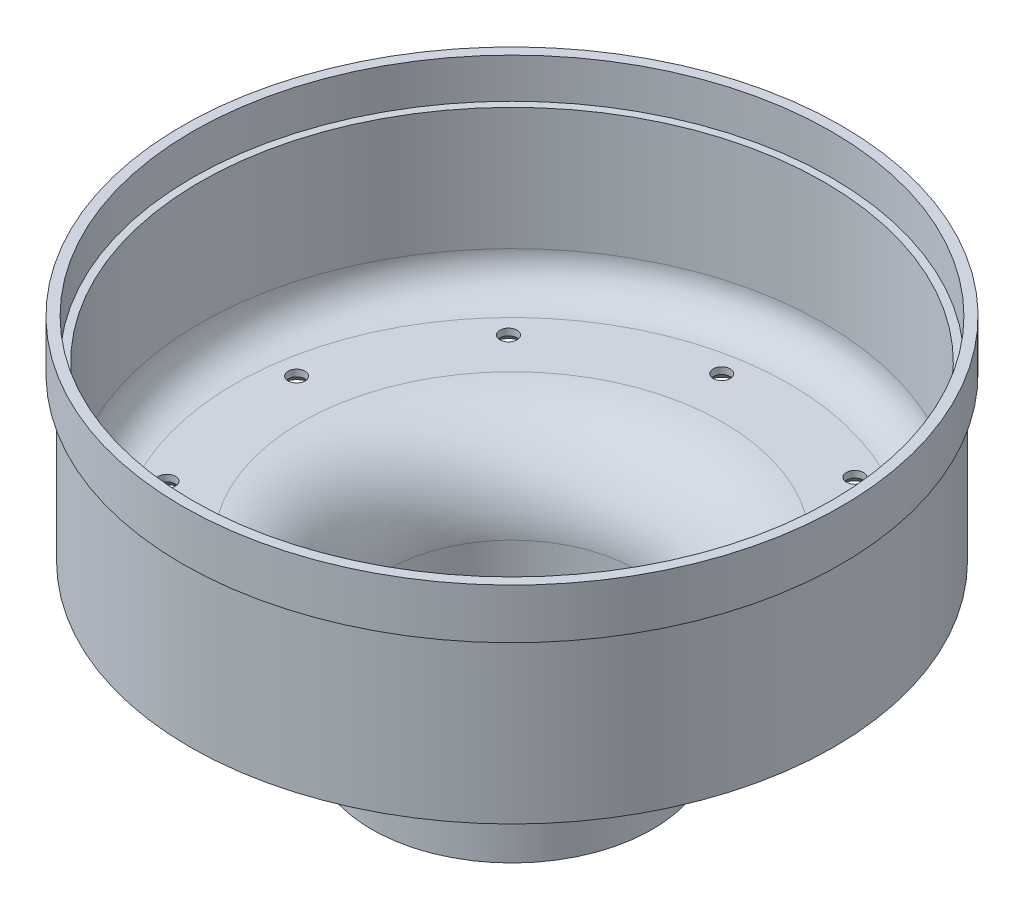
ISO-10303-21;
HEADER;
FILE_DESCRIPTION(('STEP AP214'),'2;1');
FILE_NAME('part.step','',(''),(''),'','','');
FILE_SCHEMA(('AUTOMOTIVE_DESIGN { 1 0 10303 214 1 1 1 1 }'));
ENDSEC;
DATA;
#1=APPLICATION_CONTEXT('core data for automotive mechanical design processes');
#2=APPLICATION_PROTOCOL_DEFINITION('international standard','automotive_design',2000,#1);
#3=PRODUCT_CONTEXT('',#1,'mechanical');
#4=PRODUCT('Part','Part','',(#3));
#5=PRODUCT_RELATED_PRODUCT_CATEGORY('part','',(#4));
#6=PRODUCT_DEFINITION_FORMATION('','',#4);
#7=PRODUCT_DEFINITION_CONTEXT('part definition',#1,'design');
#8=PRODUCT_DEFINITION('design','',#6,#7);
#9=PRODUCT_DEFINITION_SHAPE('','',#8);
#10=(LENGTH_UNIT() NAMED_UNIT(*) SI_UNIT(.MILLI.,.METRE.));
#11=(NAMED_UNIT(*) PLANE_ANGLE_UNIT() SI_UNIT($,.RADIAN.));
#12=(NAMED_UNIT(*) SI_UNIT($,.STERADIAN.) SOLID_ANGLE_UNIT());
#13=UNCERTAINTY_MEASURE_WITH_UNIT(LENGTH_MEASURE(1.E-05),#10,'distance_accuracy_value','');
#14=(GEOMETRIC_REPRESENTATION_CONTEXT(3) GLOBAL_UNCERTAINTY_ASSIGNED_CONTEXT((#13)) GLOBAL_UNIT_ASSIGNED_CONTEXT((#10,
#11,#12)) REPRESENTATION_CONTEXT('',''));
#15=CARTESIAN_POINT('',(0.,0.,0.));
#16=DIRECTION('',(0.,0.,1.));
#17=DIRECTION('',(1.,0.,0.));
#18=AXIS2_PLACEMENT_3D('',#15,#16,#17);
#19=CARTESIAN_POINT('',(26.6,-13.6483913577071,0.));
#20=DIRECTION('',(0.,-1.,0.));
#21=DIRECTION('',(0.,0.,-1.));
#22=AXIS2_PLACEMENT_3D('',#19,#20,#21);
#23=PLANE('',#22);
#24=CARTESIAN_POINT('',(0.,-13.6483913577071,0.));
#25=DIRECTION('',(0.,-1.,0.));
#26=DIRECTION('',(0.,0.,-1.));
#27=AXIS2_PLACEMENT_3D('',#24,#25,#26);
#28=CIRCLE('',#27,28.1);
#29=CARTESIAN_POINT('',(0.,-13.6483913577071,-28.1));
#30=VERTEX_POINT('',#29);
#31=EDGE_CURVE('E53',#30,#30,#28,.T.);
#32=ORIENTED_EDGE('',*,*,#31,.T.);
#33=EDGE_LOOP('',(#32));
#34=FACE_BOUND('',#33,.T.);
#35=CARTESIAN_POINT('',(0.,-13.6483913577071,0.));
#36=DIRECTION('',(0.,-1.,0.));
#37=DIRECTION('',(0.,0.,-1.));
#38=AXIS2_PLACEMENT_3D('',#35,#36,#37);
#39=CIRCLE('',#38,26.6);
#40=CARTESIAN_POINT('',(0.,-13.6483913577071,-26.6));
#41=VERTEX_POINT('',#40);
#42=EDGE_CURVE('E10',#41,#41,#39,.T.);
#43=ORIENTED_EDGE('',*,*,#42,.F.);
#44=EDGE_LOOP('',(#43));
#45=FACE_BOUND('',#44,.T.);
#46=ADVANCED_FACE('F34',(#34,#45),#23,.T.);
#47=CARTESIAN_POINT('',(0.,0.,0.));
#48=DIRECTION('',(0.,-1.,0.));
#49=DIRECTION('',(0.,0.,-1.));
#50=AXIS2_PLACEMENT_3D('',#47,#48,#49);
#51=CYLINDRICAL_SURFACE('',#50,26.6);
#52=ORIENTED_EDGE('',*,*,#42,.T.);
#53=EDGE_LOOP('',(#52));
#54=FACE_BOUND('',#53,.T.);
#55=CARTESIAN_POINT('',(0.,-3.64839135770706,0.));
#56=DIRECTION('',(0.,-1.,0.));
#57=DIRECTION('',(0.,0.,-1.));
#58=AXIS2_PLACEMENT_3D('',#55,#56,#57);
#59=CIRCLE('',#58,26.6);
#60=CARTESIAN_POINT('',(0.,-3.64839135770706,-26.6));
#61=VERTEX_POINT('',#60);
#62=EDGE_CURVE('E41',#61,#61,#59,.T.);
#63=ORIENTED_EDGE('',*,*,#62,.F.);
#64=EDGE_LOOP('',(#63));
#65=FACE_BOUND('',#64,.T.);
#66=ADVANCED_FACE('F184',(#54,#65),#51,.F.);
#67=CARTESIAN_POINT('',(26.6,-3.64839135770706,0.));
#68=DIRECTION('',(0.,-1.,0.));
#69=DIRECTION('',(0.,0.,-1.));
#70=AXIS2_PLACEMENT_3D('',#67,#68,#69);
#71=PLANE('',#70);
#72=ORIENTED_EDGE('',*,*,#62,.T.);
#73=EDGE_LOOP('',(#72));
#74=FACE_BOUND('',#73,.T.);
#75=CARTESIAN_POINT('',(0.,-3.64839135770706,0.));
#76=DIRECTION('',(0.,-1.,0.));
#77=DIRECTION('',(0.,0.,-1.));
#78=AXIS2_PLACEMENT_3D('',#75,#76,#77);
#79=CIRCLE('',#78,25.1);
#80=CARTESIAN_POINT('',(0.,-3.64839135770706,-25.1));
#81=VERTEX_POINT('',#80);
#82=EDGE_CURVE('E46',#81,#81,#79,.T.);
#83=ORIENTED_EDGE('',*,*,#82,.F.);
#84=EDGE_LOOP('',(#83));
#85=FACE_BOUND('',#84,.T.);
#86=ADVANCED_FACE('F182',(#74,#85),#71,.T.);
#87=CARTESIAN_POINT('',(0.,0.,0.));
#88=DIRECTION('',(0.,-1.,0.));
#89=DIRECTION('',(0.,0.,-1.));
#90=AXIS2_PLACEMENT_3D('',#87,#88,#89);
#91=CYLINDRICAL_SURFACE('',#90,25.1);
#92=ORIENTED_EDGE('',*,*,#82,.T.);
#93=EDGE_LOOP('',(#92));
#94=FACE_BOUND('',#93,.T.);
#95=CARTESIAN_POINT('',(0.,4.75160864229282,0.));
#96=DIRECTION('',(0.,-1.,0.));
#97=DIRECTION('',(0.,0.,-1.));
#98=AXIS2_PLACEMENT_3D('',#95,#96,#97);
#99=CIRCLE('',#98,25.1);
#100=CARTESIAN_POINT('',(0.,4.75160864229282,-25.1));
#101=VERTEX_POINT('',#100);
#102=EDGE_CURVE('E174',#101,#101,#99,.T.);
#103=ORIENTED_EDGE('',*,*,#102,.F.);
#104=EDGE_LOOP('',(#103));
#105=FACE_BOUND('',#104,.T.);
#106=ADVANCED_FACE('F179',(#94,#105),#91,.F.);
#107=CARTESIAN_POINT('',(0.,4.75160864229294,0.));
#108=DIRECTION('',(0.,-1.,0.));
#109=DIRECTION('',(0.,0.,-1.));
#110=AXIS2_PLACEMENT_3D('',#107,#108,#109);
#111=TOROIDAL_SURFACE('',#110,42.2,17.1);
#112=ORIENTED_EDGE('',*,*,#102,.T.);
#113=EDGE_LOOP('',(#112));
#114=FACE_BOUND('',#113,.T.);
#115=CARTESIAN_POINT('',(0.,21.8516086422929,0.));
#116=DIRECTION('',(0.,-1.,0.));
#117=DIRECTION('',(0.,0.,-1.));
#118=AXIS2_PLACEMENT_3D('',#115,#116,#117);
#119=CIRCLE('',#118,42.2000000000001);
#120=CARTESIAN_POINT('',(0.,21.8516086422929,-42.2000000000001));
#121=VERTEX_POINT('',#120);
#122=EDGE_CURVE('E171',#121,#121,#119,.T.);
#123=ORIENTED_EDGE('',*,*,#122,.F.);
#124=EDGE_LOOP('',(#123));
#125=FACE_BOUND('',#124,.T.);
#126=ADVANCED_FACE('F191',(#114,#125),#111,.T.);
#127=CARTESIAN_POINT('',(42.2000000000001,21.8516086422929,0.));
#128=DIRECTION('',(0.,1.,0.));
#129=DIRECTION('',(0.,0.,1.));
#130=AXIS2_PLACEMENT_3D('',#127,#128,#129);
#131=PLANE('',#130);
#132=CARTESIAN_POINT('',(-22.8065107885822,21.8516086422929,45.8515328604212));
#133=DIRECTION('',(0.,1.,0.));
#134=DIRECTION('',(0.,0.,1.));
#135=AXIS2_PLACEMENT_3D('',#132,#133,#134);
#136=CIRCLE('',#135,1.69999999999999);
#137=CARTESIAN_POINT('',(-22.8065107885822,21.8516086422929,47.5515328604212));
#138=VERTEX_POINT('',#137);
#139=EDGE_CURVE('E37',#138,#138,#136,.T.);
#140=ORIENTED_EDGE('',*,*,#139,.F.);
#141=EDGE_LOOP('',(#140));
#142=FACE_BOUND('',#141,.T.);
#143=CARTESIAN_POINT('',(-45.4017096207179,21.8516086422929,23.6893386044442));
#144=DIRECTION('',(0.,1.,0.));
#145=DIRECTION('',(0.,0.,1.));
#146=AXIS2_PLACEMENT_3D('',#143,#144,#145);
#147=CIRCLE('',#146,1.7);
#148=CARTESIAN_POINT('',(-45.4017096207179,21.8516086422929,25.3893386044442));
#149=VERTEX_POINT('',#148);
#150=EDGE_CURVE('E89',#149,#149,#147,.T.);
#151=ORIENTED_EDGE('',*,*,#150,.F.);
#152=EDGE_LOOP('',(#151));
#153=FACE_BOUND('',#152,.T.);
#154=CARTESIAN_POINT('',(-50.6549985250924,21.8516086422929,-7.52137782742555));
#155=DIRECTION('',(0.,1.,0.));
#156=DIRECTION('',(0.,0.,1.));
#157=AXIS2_PLACEMENT_3D('',#154,#155,#156);
#158=CIRCLE('',#157,1.7);
#159=CARTESIAN_POINT('',(-50.6549985250924,21.8516086422929,-5.82137782742556));
#160=VERTEX_POINT('',#159);
#161=EDGE_CURVE('E85',#160,#160,#158,.T.);
#162=ORIENTED_EDGE('',*,*,#161,.F.);
#163=EDGE_LOOP('',(#162));
#164=FACE_BOUND('',#163,.T.);
#165=CARTESIAN_POINT('',(-36.5597996929573,21.8516086422929,-35.8591835714485));
#166=DIRECTION('',(0.,1.,0.));
#167=DIRECTION('',(0.,0.,1.));
#168=AXIS2_PLACEMENT_3D('',#165,#166,#167);
#169=CIRCLE('',#168,1.7);
#170=CARTESIAN_POINT('',(-36.5597996929573,21.8516086422929,-34.1591835714485));
#171=VERTEX_POINT('',#170);
#172=EDGE_CURVE('E80',#171,#171,#169,.T.);
#173=ORIENTED_EDGE('',*,*,#172,.F.);
#174=EDGE_LOOP('',(#173));
#175=FACE_BOUND('',#174,.T.);
#176=CARTESIAN_POINT('',(-8.5,21.8516086422929,-50.5));
#177=DIRECTION('',(0.,1.,0.));
#178=DIRECTION('',(0.,0.,1.));
#179=AXIS2_PLACEMENT_3D('',#176,#177,#178);
#180=CIRCLE('',#179,1.69999999999999);
#181=CARTESIAN_POINT('',(-8.5,21.8516086422929,-48.8));
#182=VERTEX_POINT('',#181);
#183=EDGE_CURVE('E75',#182,#182,#180,.T.);
#184=ORIENTED_EDGE('',*,*,#183,.F.);
#185=EDGE_LOOP('',(#184));
#186=FACE_BOUND('',#185,.T.);
#187=CARTESIAN_POINT('',(22.8065107885826,21.8516086422929,-45.851532860421));
#188=DIRECTION('',(0.,1.,0.));
#189=DIRECTION('',(0.,0.,1.));
#190=AXIS2_PLACEMENT_3D('',#187,#188,#189);
#191=CIRCLE('',#190,1.69999999999999);
#192=CARTESIAN_POINT('',(22.8065107885826,21.8516086422929,-44.151532860421));
#193=VERTEX_POINT('',#192);
#194=EDGE_CURVE('E70',#193,#193,#191,.T.);
#195=ORIENTED_EDGE('',*,*,#194,.F.);
#196=EDGE_LOOP('',(#195));
#197=FACE_BOUND('',#196,.T.);
#198=CARTESIAN_POINT('',(45.4017096207181,21.8516086422929,-23.6893386044439));
#199=DIRECTION('',(0.,1.,0.));
#200=DIRECTION('',(0.,0.,1.));
#201=AXIS2_PLACEMENT_3D('',#198,#199,#200);
#202=CIRCLE('',#201,1.7);
#203=CARTESIAN_POINT('',(45.4017096207181,21.8516086422929,-21.9893386044439));
#204=VERTEX_POINT('',#203);
#205=EDGE_CURVE('E65',#204,#204,#202,.T.);
#206=ORIENTED_EDGE('',*,*,#205,.F.);
#207=EDGE_LOOP('',(#206));
#208=FACE_BOUND('',#207,.T.);
#209=CARTESIAN_POINT('',(50.6549985250923,21.8516086422929,7.5213778274259));
#210=DIRECTION('',(0.,1.,0.));
#211=DIRECTION('',(0.,0.,1.));
#212=AXIS2_PLACEMENT_3D('',#209,#210,#211);
#213=CIRCLE('',#212,1.7);
#214=CARTESIAN_POINT('',(50.6549985250923,21.8516086422929,9.2213778274259));
#215=VERTEX_POINT('',#214);
#216=EDGE_CURVE('E60',#215,#215,#213,.T.);
#217=ORIENTED_EDGE('',*,*,#216,.F.);
#218=EDGE_LOOP('',(#217));
#219=FACE_BOUND('',#218,.T.);
#220=CARTESIAN_POINT('',(36.559799692957,21.8516086422929,35.8591835714488));
#221=DIRECTION('',(0.,1.,0.));
#222=DIRECTION('',(0.,0.,1.));
#223=AXIS2_PLACEMENT_3D('',#220,#221,#222);
#224=CIRCLE('',#223,1.7);
#225=CARTESIAN_POINT('',(36.559799692957,21.8516086422929,37.5591835714488));
#226=VERTEX_POINT('',#225);
#227=EDGE_CURVE('E55',#226,#226,#224,.T.);
#228=ORIENTED_EDGE('',*,*,#227,.F.);
#229=EDGE_LOOP('',(#228));
#230=FACE_BOUND('',#229,.T.);
#231=CARTESIAN_POINT('',(8.5,21.8516086422929,50.5));
#232=DIRECTION('',(0.,1.,0.));
#233=DIRECTION('',(0.,0.,1.));
#234=AXIS2_PLACEMENT_3D('',#231,#232,#233);
#235=CIRCLE('',#234,1.69999999999999);
#236=CARTESIAN_POINT('',(8.5,21.8516086422929,52.2));
#237=VERTEX_POINT('',#236);
#238=EDGE_CURVE('E50',#237,#237,#235,.T.);
#239=ORIENTED_EDGE('',*,*,#238,.F.);
#240=EDGE_LOOP('',(#239));
#241=FACE_BOUND('',#240,.T.);
#242=ORIENTED_EDGE('',*,*,#122,.T.);
#243=EDGE_LOOP('',(#242));
#244=FACE_BOUND('',#243,.T.);
#245=CARTESIAN_POINT('',(0.,21.8516086422929,0.));
#246=DIRECTION('',(0.,-1.,0.));
#247=DIRECTION('',(0.,0.,-1.));
#248=AXIS2_PLACEMENT_3D('',#245,#246,#247);
#249=CIRCLE('',#248,55.5);
#250=CARTESIAN_POINT('',(0.,21.8516086422929,-55.5));
#251=VERTEX_POINT('',#250);
#252=EDGE_CURVE('E168',#251,#251,#249,.T.);
#253=ORIENTED_EDGE('',*,*,#252,.F.);
#254=EDGE_LOOP('',(#253));
#255=FACE_BOUND('',#254,.T.);
#256=ADVANCED_FACE('F252',(#142,#153,#164,#175,#186,#197,#208,#219,#230,#241,#244,#255),#131,.T.);
#257=CARTESIAN_POINT('',(0.,28.8516086422929,0.));
#258=DIRECTION('',(0.,-1.,0.));
#259=DIRECTION('',(0.,0.,-1.));
#260=AXIS2_PLACEMENT_3D('',#257,#258,#259);
#261=TOROIDAL_SURFACE('',#260,55.5,7.);
#262=ORIENTED_EDGE('',*,*,#252,.T.);
#263=EDGE_LOOP('',(#262));
#264=FACE_BOUND('',#263,.T.);
#265=CARTESIAN_POINT('',(0.,28.8516086422929,0.));
#266=DIRECTION('',(0.,-1.,0.));
#267=DIRECTION('',(0.,0.,-1.));
#268=AXIS2_PLACEMENT_3D('',#265,#266,#267);
#269=CIRCLE('',#268,62.5);
#270=CARTESIAN_POINT('',(0.,28.8516086422929,-62.5));
#271=VERTEX_POINT('',#270);
#272=EDGE_CURVE('E165',#271,#271,#269,.T.);
#273=ORIENTED_EDGE('',*,*,#272,.F.);
#274=EDGE_LOOP('',(#273));
#275=FACE_BOUND('',#274,.T.);
#276=ADVANCED_FACE('F248',(#264,#275),#261,.F.);
#277=CARTESIAN_POINT('',(0.,0.,0.));
#278=DIRECTION('',(0.,-1.,0.));
#279=DIRECTION('',(0.,0.,-1.));
#280=AXIS2_PLACEMENT_3D('',#277,#278,#279);
#281=CYLINDRICAL_SURFACE('',#280,62.5);
#282=ORIENTED_EDGE('',*,*,#272,.T.);
#283=EDGE_LOOP('',(#282));
#284=FACE_BOUND('',#283,.T.);
#285=CARTESIAN_POINT('',(0.,53.3516086422929,0.));
#286=DIRECTION('',(0.,-1.,0.));
#287=DIRECTION('',(0.,0.,-1.));
#288=AXIS2_PLACEMENT_3D('',#285,#286,#287);
#289=CIRCLE('',#288,62.5);
#290=CARTESIAN_POINT('',(0.,53.3516086422929,-62.5));
#291=VERTEX_POINT('',#290);
#292=EDGE_CURVE('E162',#291,#291,#289,.T.);
#293=ORIENTED_EDGE('',*,*,#292,.F.);
#294=EDGE_LOOP('',(#293));
#295=FACE_BOUND('',#294,.T.);
#296=ADVANCED_FACE('F244',(#284,#295),#281,.F.);
#297=CARTESIAN_POINT('',(62.5,53.351608642293,0.));
#298=DIRECTION('',(0.,1.,0.));
#299=DIRECTION('',(0.,0.,1.));
#300=AXIS2_PLACEMENT_3D('',#297,#298,#299);
#301=PLANE('',#300);
#302=ORIENTED_EDGE('',*,*,#292,.T.);
#303=EDGE_LOOP('',(#302));
#304=FACE_BOUND('',#303,.T.);
#305=CARTESIAN_POINT('',(0.,53.351608642293,0.));
#306=DIRECTION('',(0.,-1.,0.));
#307=DIRECTION('',(0.,0.,-1.));
#308=AXIS2_PLACEMENT_3D('',#305,#306,#307);
#309=CIRCLE('',#308,64.);
#310=CARTESIAN_POINT('',(0.,53.351608642293,-64.));
#311=VERTEX_POINT('',#310);
#312=EDGE_CURVE('E159',#311,#311,#309,.T.);
#313=ORIENTED_EDGE('',*,*,#312,.F.);
#314=EDGE_LOOP('',(#313));
#315=FACE_BOUND('',#314,.T.);
#316=ADVANCED_FACE('F240',(#304,#315),#301,.T.);
#317=CARTESIAN_POINT('',(0.,0.,0.));
#318=DIRECTION('',(0.,-1.,0.));
#319=DIRECTION('',(0.,0.,-1.));
#320=AXIS2_PLACEMENT_3D('',#317,#318,#319);
#321=CYLINDRICAL_SURFACE('',#320,64.);
#322=ORIENTED_EDGE('',*,*,#312,.T.);
#323=EDGE_LOOP('',(#322));
#324=FACE_BOUND('',#323,.T.);
#325=CARTESIAN_POINT('',(0.,61.3516086422929,0.));
#326=DIRECTION('',(0.,-1.,0.));
#327=DIRECTION('',(0.,0.,-1.));
#328=AXIS2_PLACEMENT_3D('',#325,#326,#327);
#329=CIRCLE('',#328,64.);
#330=CARTESIAN_POINT('',(0.,61.3516086422929,-64.));
#331=VERTEX_POINT('',#330);
#332=EDGE_CURVE('E156',#331,#331,#329,.T.);
#333=ORIENTED_EDGE('',*,*,#332,.F.);
#334=EDGE_LOOP('',(#333));
#335=FACE_BOUND('',#334,.T.);
#336=ADVANCED_FACE('F236',(#324,#335),#321,.F.);
#337=CARTESIAN_POINT('',(66.,61.3516086422929,0.));
#338=DIRECTION('',(0.,1.,0.));
#339=DIRECTION('',(0.,0.,1.));
#340=AXIS2_PLACEMENT_3D('',#337,#338,#339);
#341=PLANE('',#340);
#342=ORIENTED_EDGE('',*,*,#332,.T.);
#343=EDGE_LOOP('',(#342));
#344=FACE_BOUND('',#343,.T.);
#345=CARTESIAN_POINT('',(0.,61.3516086422929,0.));
#346=DIRECTION('',(0.,-1.,0.));
#347=DIRECTION('',(0.,0.,-1.));
#348=AXIS2_PLACEMENT_3D('',#345,#346,#347);
#349=CIRCLE('',#348,66.);
#350=CARTESIAN_POINT('',(0.,61.3516086422929,-66.));
#351=VERTEX_POINT('',#350);
#352=EDGE_CURVE('E153',#351,#351,#349,.T.);
#353=ORIENTED_EDGE('',*,*,#352,.F.);
#354=EDGE_LOOP('',(#353));
#355=FACE_BOUND('',#354,.T.);
#356=ADVANCED_FACE('F232',(#344,#355),#341,.T.);
#357=CARTESIAN_POINT('',(0.,0.,0.));
#358=DIRECTION('',(0.,-1.,0.));
#359=DIRECTION('',(0.,0.,-1.));
#360=AXIS2_PLACEMENT_3D('',#357,#358,#359);
#361=CYLINDRICAL_SURFACE('',#360,66.);
#362=ORIENTED_EDGE('',*,*,#352,.T.);
#363=EDGE_LOOP('',(#362));
#364=FACE_BOUND('',#363,.T.);
#365=CARTESIAN_POINT('',(0.,51.3516086422929,0.));
#366=DIRECTION('',(0.,-1.,0.));
#367=DIRECTION('',(0.,0.,-1.));
#368=AXIS2_PLACEMENT_3D('',#365,#366,#367);
#369=CIRCLE('',#368,66.);
#370=CARTESIAN_POINT('',(0.,51.3516086422929,-66.));
#371=VERTEX_POINT('',#370);
#372=EDGE_CURVE('E150',#371,#371,#369,.T.);
#373=ORIENTED_EDGE('',*,*,#372,.F.);
#374=EDGE_LOOP('',(#373));
#375=FACE_BOUND('',#374,.T.);
#376=ADVANCED_FACE('F228',(#364,#375),#361,.T.);
#377=CARTESIAN_POINT('',(64.5,51.3516086422929,0.));
#378=DIRECTION('',(0.,-1.,0.));
#379=DIRECTION('',(0.,0.,-1.));
#380=AXIS2_PLACEMENT_3D('',#377,#378,#379);
#381=PLANE('',#380);
#382=ORIENTED_EDGE('',*,*,#372,.T.);
#383=EDGE_LOOP('',(#382));
#384=FACE_BOUND('',#383,.T.);
#385=CARTESIAN_POINT('',(0.,51.3516086422929,0.));
#386=DIRECTION('',(0.,-1.,0.));
#387=DIRECTION('',(0.,0.,-1.));
#388=AXIS2_PLACEMENT_3D('',#385,#386,#387);
#389=CIRCLE('',#388,64.5);
#390=CARTESIAN_POINT('',(0.,51.3516086422929,-64.5));
#391=VERTEX_POINT('',#390);
#392=EDGE_CURVE('E147',#391,#391,#389,.T.);
#393=ORIENTED_EDGE('',*,*,#392,.F.);
#394=EDGE_LOOP('',(#393));
#395=FACE_BOUND('',#394,.T.);
#396=ADVANCED_FACE('F224',(#384,#395),#381,.T.);
#397=CARTESIAN_POINT('',(0.,0.,0.));
#398=DIRECTION('',(0.,-1.,0.));
#399=DIRECTION('',(0.,0.,-1.));
#400=AXIS2_PLACEMENT_3D('',#397,#398,#399);
#401=CYLINDRICAL_SURFACE('',#400,64.5);
#402=ORIENTED_EDGE('',*,*,#392,.T.);
#403=EDGE_LOOP('',(#402));
#404=FACE_BOUND('',#403,.T.);
#405=CARTESIAN_POINT('',(0.,18.8516086422929,0.));
#406=DIRECTION('',(0.,-1.,0.));
#407=DIRECTION('',(0.,0.,-1.));
#408=AXIS2_PLACEMENT_3D('',#405,#406,#407);
#409=CIRCLE('',#408,64.5);
#410=CARTESIAN_POINT('',(0.,18.8516086422929,-64.5));
#411=VERTEX_POINT('',#410);
#412=EDGE_CURVE('E144',#411,#411,#409,.T.);
#413=ORIENTED_EDGE('',*,*,#412,.F.);
#414=EDGE_LOOP('',(#413));
#415=FACE_BOUND('',#414,.T.);
#416=ADVANCED_FACE('F220',(#404,#415),#401,.T.);
#417=CARTESIAN_POINT('',(39.9800000000001,18.8516086422929,0.));
#418=DIRECTION('',(0.,-1.,0.));
#419=DIRECTION('',(0.,0.,-1.));
#420=AXIS2_PLACEMENT_3D('',#417,#418,#419);
#421=PLANE('',#420);
#422=CARTESIAN_POINT('',(-22.8065107885822,18.8516086422929,45.8515328604212));
#423=DIRECTION('',(0.,-1.,0.));
#424=DIRECTION('',(0.,0.,-1.));
#425=AXIS2_PLACEMENT_3D('',#422,#423,#424);
#426=CIRCLE('',#425,3.36);
#427=CARTESIAN_POINT('',(-22.8065107885822,18.8516086422929,42.4915328604212));
#428=VERTEX_POINT('',#427);
#429=EDGE_CURVE('E541',#428,#428,#426,.T.);
#430=ORIENTED_EDGE('',*,*,#429,.F.);
#431=EDGE_LOOP('',(#430));
#432=FACE_BOUND('',#431,.T.);
#433=CARTESIAN_POINT('',(-45.4017096207179,18.8516086422929,23.6893386044442));
#434=DIRECTION('',(0.,-1.,0.));
#435=DIRECTION('',(0.,0.,-1.));
#436=AXIS2_PLACEMENT_3D('',#433,#434,#435);
#437=CIRCLE('',#436,3.36);
#438=CARTESIAN_POINT('',(-45.4017096207179,18.8516086422929,20.3293386044442));
#439=VERTEX_POINT('',#438);
#440=EDGE_CURVE('E98',#439,#439,#437,.T.);
#441=ORIENTED_EDGE('',*,*,#440,.F.);
#442=EDGE_LOOP('',(#441));
#443=FACE_BOUND('',#442,.T.);
#444=CARTESIAN_POINT('',(-50.6549985250924,18.8516086422929,-7.52137782742555));
#445=DIRECTION('',(0.,-1.,0.));
#446=DIRECTION('',(0.,0.,-1.));
#447=AXIS2_PLACEMENT_3D('',#444,#445,#446);
#448=CIRCLE('',#447,3.36);
#449=CARTESIAN_POINT('',(-50.6549985250924,18.8516086422929,-10.8813778274256));
#450=VERTEX_POINT('',#449);
#451=EDGE_CURVE('E91',#450,#450,#448,.T.);
#452=ORIENTED_EDGE('',*,*,#451,.F.);
#453=EDGE_LOOP('',(#452));
#454=FACE_BOUND('',#453,.T.);
#455=CARTESIAN_POINT('',(-36.5597996929573,18.8516086422929,-35.8591835714485));
#456=DIRECTION('',(0.,-1.,0.));
#457=DIRECTION('',(0.,0.,-1.));
#458=AXIS2_PLACEMENT_3D('',#455,#456,#457);
#459=CIRCLE('',#458,3.36);
#460=CARTESIAN_POINT('',(-36.5597996929573,18.8516086422929,-39.2191835714485));
#461=VERTEX_POINT('',#460);
#462=EDGE_CURVE('E87',#461,#461,#459,.T.);
#463=ORIENTED_EDGE('',*,*,#462,.F.);
#464=EDGE_LOOP('',(#463));
#465=FACE_BOUND('',#464,.T.);
#466=CARTESIAN_POINT('',(-8.5,18.8516086422929,-50.5));
#467=DIRECTION('',(0.,-1.,0.));
#468=DIRECTION('',(0.,0.,-1.));
#469=AXIS2_PLACEMENT_3D('',#466,#467,#468);
#470=CIRCLE('',#469,3.36);
#471=CARTESIAN_POINT('',(-8.5,18.8516086422929,-53.86));
#472=VERTEX_POINT('',#471);
#473=EDGE_CURVE('E83',#472,#472,#470,.T.);
#474=ORIENTED_EDGE('',*,*,#473,.F.);
#475=EDGE_LOOP('',(#474));
#476=FACE_BOUND('',#475,.T.);
#477=CARTESIAN_POINT('',(22.8065107885826,18.8516086422929,-45.851532860421));
#478=DIRECTION('',(0.,-1.,0.));
#479=DIRECTION('',(0.,0.,-1.));
#480=AXIS2_PLACEMENT_3D('',#477,#478,#479);
#481=CIRCLE('',#480,3.36);
#482=CARTESIAN_POINT('',(22.8065107885826,18.8516086422929,-49.211532860421));
#483=VERTEX_POINT('',#482);
#484=EDGE_CURVE('E78',#483,#483,#481,.T.);
#485=ORIENTED_EDGE('',*,*,#484,.F.);
#486=EDGE_LOOP('',(#485));
#487=FACE_BOUND('',#486,.T.);
#488=CARTESIAN_POINT('',(45.4017096207181,18.8516086422929,-23.6893386044439));
#489=DIRECTION('',(0.,-1.,0.));
#490=DIRECTION('',(0.,0.,-1.));
#491=AXIS2_PLACEMENT_3D('',#488,#489,#490);
#492=CIRCLE('',#491,3.36);
#493=CARTESIAN_POINT('',(45.4017096207181,18.8516086422929,-27.0493386044439));
#494=VERTEX_POINT('',#493);
#495=EDGE_CURVE('E73',#494,#494,#492,.T.);
#496=ORIENTED_EDGE('',*,*,#495,.F.);
#497=EDGE_LOOP('',(#496));
#498=FACE_BOUND('',#497,.T.);
#499=CARTESIAN_POINT('',(50.6549985250923,18.8516086422929,7.5213778274259));
#500=DIRECTION('',(0.,-1.,0.));
#501=DIRECTION('',(0.,0.,-1.));
#502=AXIS2_PLACEMENT_3D('',#499,#500,#501);
#503=CIRCLE('',#502,3.36);
#504=CARTESIAN_POINT('',(50.6549985250923,18.8516086422929,4.1613778274259));
#505=VERTEX_POINT('',#504);
#506=EDGE_CURVE('E68',#505,#505,#503,.T.);
#507=ORIENTED_EDGE('',*,*,#506,.F.);
#508=EDGE_LOOP('',(#507));
#509=FACE_BOUND('',#508,.T.);
#510=CARTESIAN_POINT('',(36.559799692957,18.8516086422929,35.8591835714488));
#511=DIRECTION('',(0.,-1.,0.));
#512=DIRECTION('',(0.,0.,-1.));
#513=AXIS2_PLACEMENT_3D('',#510,#511,#512);
#514=CIRCLE('',#513,3.36);
#515=CARTESIAN_POINT('',(36.559799692957,18.8516086422929,32.4991835714488));
#516=VERTEX_POINT('',#515);
#517=EDGE_CURVE('E63',#516,#516,#514,.T.);
#518=ORIENTED_EDGE('',*,*,#517,.F.);
#519=EDGE_LOOP('',(#518));
#520=FACE_BOUND('',#519,.T.);
#521=CARTESIAN_POINT('',(8.5,18.8516086422929,50.5));
#522=DIRECTION('',(0.,-1.,0.));
#523=DIRECTION('',(0.,0.,-1.));
#524=AXIS2_PLACEMENT_3D('',#521,#522,#523);
#525=CIRCLE('',#524,3.36);
#526=CARTESIAN_POINT('',(8.5,18.8516086422929,47.14));
#527=VERTEX_POINT('',#526);
#528=EDGE_CURVE('E58',#527,#527,#525,.T.);
#529=ORIENTED_EDGE('',*,*,#528,.F.);
#530=EDGE_LOOP('',(#529));
#531=FACE_BOUND('',#530,.T.);
#532=ORIENTED_EDGE('',*,*,#412,.T.);
#533=EDGE_LOOP('',(#532));
#534=FACE_BOUND('',#533,.T.);
#535=CARTESIAN_POINT('',(0.,18.8516086422929,0.));
#536=DIRECTION('',(0.,-1.,0.));
#537=DIRECTION('',(0.,0.,-1.));
#538=AXIS2_PLACEMENT_3D('',#535,#536,#537);
#539=CIRCLE('',#538,39.9800000000001);
#540=CARTESIAN_POINT('',(0.,18.8516086422929,-39.9800000000001));
#541=VERTEX_POINT('',#540);
#542=EDGE_CURVE('E141',#541,#541,#539,.T.);
#543=ORIENTED_EDGE('',*,*,#542,.F.);
#544=EDGE_LOOP('',(#543));
#545=FACE_BOUND('',#544,.T.);
#546=ADVANCED_FACE('F213',(#432,#443,#454,#465,#476,#487,#498,#509,#520,#531,#534,#545),#421,.T.);
#547=CARTESIAN_POINT('',(0.,6.97160864229294,0.));
#548=DIRECTION('',(0.,-1.,0.));
#549=DIRECTION('',(0.,0.,-1.));
#550=AXIS2_PLACEMENT_3D('',#547,#548,#549);
#551=TOROIDAL_SURFACE('',#550,39.98,11.88);
#552=ORIENTED_EDGE('',*,*,#542,.T.);
#553=EDGE_LOOP('',(#552));
#554=FACE_BOUND('',#553,.T.);
#555=CARTESIAN_POINT('',(0.,6.97160864229286,0.));
#556=DIRECTION('',(0.,-1.,0.));
#557=DIRECTION('',(0.,0.,-1.));
#558=AXIS2_PLACEMENT_3D('',#555,#556,#557);
#559=CIRCLE('',#558,28.1);
#560=CARTESIAN_POINT('',(0.,6.97160864229286,-28.1));
#561=VERTEX_POINT('',#560);
#562=EDGE_CURVE('E138',#561,#561,#559,.T.);
#563=ORIENTED_EDGE('',*,*,#562,.F.);
#564=EDGE_LOOP('',(#563));
#565=FACE_BOUND('',#564,.T.);
#566=ADVANCED_FACE('F203',(#554,#565),#551,.F.);
#567=CARTESIAN_POINT('',(0.,0.,0.));
#568=DIRECTION('',(0.,-1.,0.));
#569=DIRECTION('',(0.,0.,-1.));
#570=AXIS2_PLACEMENT_3D('',#567,#568,#569);
#571=CYLINDRICAL_SURFACE('',#570,28.1);
#572=ORIENTED_EDGE('',*,*,#562,.T.);
#573=EDGE_LOOP('',(#572));
#574=FACE_BOUND('',#573,.T.);
#575=ORIENTED_EDGE('',*,*,#31,.F.);
#576=EDGE_LOOP('',(#575));
#577=FACE_BOUND('',#576,.T.);
#578=ADVANCED_FACE('F200',(#574,#577),#571,.T.);
#579=CARTESIAN_POINT('',(8.5,18.8516086422929,50.5));
#580=DIRECTION('',(0.,-1.,0.));
#581=DIRECTION('',(0.,0.,-1.));
#582=AXIS2_PLACEMENT_3D('',#579,#580,#581);
#583=CYLINDRICAL_SURFACE('',#582,1.69999999999999);
#584=ORIENTED_EDGE('',*,*,#238,.T.);
#585=EDGE_LOOP('',(#584));
#586=FACE_BOUND('',#585,.T.);
#587=CARTESIAN_POINT('',(8.5,20.5116086422929,50.5));
#588=DIRECTION('',(0.,-1.,0.));
#589=DIRECTION('',(0.,0.,-1.));
#590=AXIS2_PLACEMENT_3D('',#587,#588,#589);
#591=CIRCLE('',#590,1.7);
#592=CARTESIAN_POINT('',(8.5,20.5116086422929,48.8));
#593=VERTEX_POINT('',#592);
#594=EDGE_CURVE('E54',#593,#593,#591,.T.);
#595=ORIENTED_EDGE('',*,*,#594,.T.);
#596=EDGE_LOOP('',(#595));
#597=FACE_BOUND('',#596,.T.);
#598=ADVANCED_FACE('F202',(#586,#597),#583,.F.);
#599=CARTESIAN_POINT('',(8.5,18.8516086422929,50.5));
#600=DIRECTION('',(0.,-1.,0.));
#601=DIRECTION('',(0.,0.,-1.));
#602=AXIS2_PLACEMENT_3D('',#599,#600,#601);
#603=CONICAL_SURFACE('',#602,3.36,0.785398163397449);
#604=ORIENTED_EDGE('',*,*,#594,.F.);
#605=EDGE_LOOP('',(#604));
#606=FACE_BOUND('',#605,.T.);
#607=ORIENTED_EDGE('',*,*,#528,.T.);
#608=EDGE_LOOP('',(#607));
#609=FACE_BOUND('',#608,.T.);
#610=ADVANCED_FACE('F210',(#606,#609),#603,.F.);
#611=CARTESIAN_POINT('',(36.559799692957,18.8516086422929,35.8591835714488));
#612=DIRECTION('',(0.,-1.,0.));
#613=DIRECTION('',(0.,0.,-1.));
#614=AXIS2_PLACEMENT_3D('',#611,#612,#613);
#615=CYLINDRICAL_SURFACE('',#614,1.7);
#616=ORIENTED_EDGE('',*,*,#227,.T.);
#617=EDGE_LOOP('',(#616));
#618=FACE_BOUND('',#617,.T.);
#619=CARTESIAN_POINT('',(36.559799692957,20.5116086422929,35.8591835714488));
#620=DIRECTION('',(0.,-1.,0.));
#621=DIRECTION('',(0.,0.,-1.));
#622=AXIS2_PLACEMENT_3D('',#619,#620,#621);
#623=CIRCLE('',#622,1.7);
#624=CARTESIAN_POINT('',(36.559799692957,20.5116086422929,34.1591835714488));
#625=VERTEX_POINT('',#624);
#626=EDGE_CURVE('E59',#625,#625,#623,.T.);
#627=ORIENTED_EDGE('',*,*,#626,.T.);
#628=EDGE_LOOP('',(#627));
#629=FACE_BOUND('',#628,.T.);
#630=ADVANCED_FACE('F353',(#618,#629),#615,.F.);
#631=CARTESIAN_POINT('',(36.559799692957,18.8516086422929,35.8591835714488));
#632=DIRECTION('',(0.,-1.,0.));
#633=DIRECTION('',(0.,0.,-1.));
#634=AXIS2_PLACEMENT_3D('',#631,#632,#633);
#635=CONICAL_SURFACE('',#634,3.36,0.785398163397449);
#636=ORIENTED_EDGE('',*,*,#626,.F.);
#637=EDGE_LOOP('',(#636));
#638=FACE_BOUND('',#637,.T.);
#639=ORIENTED_EDGE('',*,*,#517,.T.);
#640=EDGE_LOOP('',(#639));
#641=FACE_BOUND('',#640,.T.);
#642=ADVANCED_FACE('F362',(#638,#641),#635,.F.);
#643=CARTESIAN_POINT('',(50.6549985250923,18.8516086422929,7.5213778274259));
#644=DIRECTION('',(0.,-1.,0.));
#645=DIRECTION('',(0.,0.,-1.));
#646=AXIS2_PLACEMENT_3D('',#643,#644,#645);
#647=CYLINDRICAL_SURFACE('',#646,1.7);
#648=ORIENTED_EDGE('',*,*,#216,.T.);
#649=EDGE_LOOP('',(#648));
#650=FACE_BOUND('',#649,.T.);
#651=CARTESIAN_POINT('',(50.6549985250923,20.5116086422929,7.5213778274259));
#652=DIRECTION('',(0.,-1.,0.));
#653=DIRECTION('',(0.,0.,-1.));
#654=AXIS2_PLACEMENT_3D('',#651,#652,#653);
#655=CIRCLE('',#654,1.7);
#656=CARTESIAN_POINT('',(50.6549985250923,20.5116086422929,5.8213778274259));
#657=VERTEX_POINT('',#656);
#658=EDGE_CURVE('E64',#657,#657,#655,.T.);
#659=ORIENTED_EDGE('',*,*,#658,.T.);
#660=EDGE_LOOP('',(#659));
#661=FACE_BOUND('',#660,.T.);
#662=ADVANCED_FACE('F369',(#650,#661),#647,.F.);
#663=CARTESIAN_POINT('',(50.6549985250923,18.8516086422929,7.5213778274259));
#664=DIRECTION('',(0.,-1.,0.));
#665=DIRECTION('',(0.,0.,-1.));
#666=AXIS2_PLACEMENT_3D('',#663,#664,#665);
#667=CONICAL_SURFACE('',#666,3.36,0.785398163397449);
#668=ORIENTED_EDGE('',*,*,#658,.F.);
#669=EDGE_LOOP('',(#668));
#670=FACE_BOUND('',#669,.T.);
#671=ORIENTED_EDGE('',*,*,#506,.T.);
#672=EDGE_LOOP('',(#671));
#673=FACE_BOUND('',#672,.T.);
#674=ADVANCED_FACE('F377',(#670,#673),#667,.F.);
#675=CARTESIAN_POINT('',(45.4017096207181,18.8516086422929,-23.6893386044439));
#676=DIRECTION('',(0.,-1.,0.));
#677=DIRECTION('',(0.,0.,-1.));
#678=AXIS2_PLACEMENT_3D('',#675,#676,#677);
#679=CYLINDRICAL_SURFACE('',#678,1.7);
#680=ORIENTED_EDGE('',*,*,#205,.T.);
#681=EDGE_LOOP('',(#680));
#682=FACE_BOUND('',#681,.T.);
#683=CARTESIAN_POINT('',(45.4017096207181,20.5116086422929,-23.6893386044439));
#684=DIRECTION('',(0.,-1.,0.));
#685=DIRECTION('',(0.,0.,-1.));
#686=AXIS2_PLACEMENT_3D('',#683,#684,#685);
#687=CIRCLE('',#686,1.7);
#688=CARTESIAN_POINT('',(45.4017096207181,20.5116086422929,-25.3893386044439));
#689=VERTEX_POINT('',#688);
#690=EDGE_CURVE('E69',#689,#689,#687,.T.);
#691=ORIENTED_EDGE('',*,*,#690,.T.);
#692=EDGE_LOOP('',(#691));
#693=FACE_BOUND('',#692,.T.);
#694=ADVANCED_FACE('F385',(#682,#693),#679,.F.);
#695=CARTESIAN_POINT('',(45.4017096207181,18.8516086422929,-23.6893386044439));
#696=DIRECTION('',(0.,-1.,0.));
#697=DIRECTION('',(0.,0.,-1.));
#698=AXIS2_PLACEMENT_3D('',#695,#696,#697);
#699=CONICAL_SURFACE('',#698,3.36,0.785398163397449);
#700=ORIENTED_EDGE('',*,*,#690,.F.);
#701=EDGE_LOOP('',(#700));
#702=FACE_BOUND('',#701,.T.);
#703=ORIENTED_EDGE('',*,*,#495,.T.);
#704=EDGE_LOOP('',(#703));
#705=FACE_BOUND('',#704,.T.);
#706=ADVANCED_FACE('F393',(#702,#705),#699,.F.);
#707=CARTESIAN_POINT('',(22.8065107885826,18.8516086422929,-45.851532860421));
#708=DIRECTION('',(0.,-1.,0.));
#709=DIRECTION('',(0.,0.,-1.));
#710=AXIS2_PLACEMENT_3D('',#707,#708,#709);
#711=CYLINDRICAL_SURFACE('',#710,1.69999999999999);
#712=ORIENTED_EDGE('',*,*,#194,.T.);
#713=EDGE_LOOP('',(#712));
#714=FACE_BOUND('',#713,.T.);
#715=CARTESIAN_POINT('',(22.8065107885826,20.5116086422929,-45.851532860421));
#716=DIRECTION('',(0.,-1.,0.));
#717=DIRECTION('',(0.,0.,-1.));
#718=AXIS2_PLACEMENT_3D('',#715,#716,#717);
#719=CIRCLE('',#718,1.7);
#720=CARTESIAN_POINT('',(22.8065107885826,20.5116086422929,-47.551532860421));
#721=VERTEX_POINT('',#720);
#722=EDGE_CURVE('E74',#721,#721,#719,.T.);
#723=ORIENTED_EDGE('',*,*,#722,.T.);
#724=EDGE_LOOP('',(#723));
#725=FACE_BOUND('',#724,.T.);
#726=ADVANCED_FACE('F401',(#714,#725),#711,.F.);
#727=CARTESIAN_POINT('',(22.8065107885826,18.8516086422929,-45.851532860421));
#728=DIRECTION('',(0.,-1.,0.));
#729=DIRECTION('',(0.,0.,-1.));
#730=AXIS2_PLACEMENT_3D('',#727,#728,#729);
#731=CONICAL_SURFACE('',#730,3.36,0.785398163397449);
#732=ORIENTED_EDGE('',*,*,#722,.F.);
#733=EDGE_LOOP('',(#732));
#734=FACE_BOUND('',#733,.T.);
#735=ORIENTED_EDGE('',*,*,#484,.T.);
#736=EDGE_LOOP('',(#735));
#737=FACE_BOUND('',#736,.T.);
#738=ADVANCED_FACE('F409',(#734,#737),#731,.F.);
#739=CARTESIAN_POINT('',(-8.5,18.8516086422929,-50.5));
#740=DIRECTION('',(0.,-1.,0.));
#741=DIRECTION('',(0.,0.,-1.));
#742=AXIS2_PLACEMENT_3D('',#739,#740,#741);
#743=CYLINDRICAL_SURFACE('',#742,1.69999999999999);
#744=ORIENTED_EDGE('',*,*,#183,.T.);
#745=EDGE_LOOP('',(#744));
#746=FACE_BOUND('',#745,.T.);
#747=CARTESIAN_POINT('',(-8.5,20.5116086422929,-50.5));
#748=DIRECTION('',(0.,-1.,0.));
#749=DIRECTION('',(0.,0.,-1.));
#750=AXIS2_PLACEMENT_3D('',#747,#748,#749);
#751=CIRCLE('',#750,1.7);
#752=CARTESIAN_POINT('',(-8.5,20.5116086422929,-52.2));
#753=VERTEX_POINT('',#752);
#754=EDGE_CURVE('E79',#753,#753,#751,.T.);
#755=ORIENTED_EDGE('',*,*,#754,.T.);
#756=EDGE_LOOP('',(#755));
#757=FACE_BOUND('',#756,.T.);
#758=ADVANCED_FACE('F417',(#746,#757),#743,.F.);
#759=CARTESIAN_POINT('',(-8.5,18.8516086422929,-50.5));
#760=DIRECTION('',(0.,-1.,0.));
#761=DIRECTION('',(0.,0.,-1.));
#762=AXIS2_PLACEMENT_3D('',#759,#760,#761);
#763=CONICAL_SURFACE('',#762,3.36,0.785398163397449);
#764=ORIENTED_EDGE('',*,*,#754,.F.);
#765=EDGE_LOOP('',(#764));
#766=FACE_BOUND('',#765,.T.);
#767=ORIENTED_EDGE('',*,*,#473,.T.);
#768=EDGE_LOOP('',(#767));
#769=FACE_BOUND('',#768,.T.);
#770=ADVANCED_FACE('F425',(#766,#769),#763,.F.);
#771=CARTESIAN_POINT('',(-36.5597996929573,18.8516086422929,-35.8591835714485));
#772=DIRECTION('',(0.,-1.,0.));
#773=DIRECTION('',(0.,0.,-1.));
#774=AXIS2_PLACEMENT_3D('',#771,#772,#773);
#775=CYLINDRICAL_SURFACE('',#774,1.7);
#776=ORIENTED_EDGE('',*,*,#172,.T.);
#777=EDGE_LOOP('',(#776));
#778=FACE_BOUND('',#777,.T.);
#779=CARTESIAN_POINT('',(-36.5597996929573,20.5116086422929,-35.8591835714485));
#780=DIRECTION('',(0.,-1.,0.));
#781=DIRECTION('',(0.,0.,-1.));
#782=AXIS2_PLACEMENT_3D('',#779,#780,#781);
#783=CIRCLE('',#782,1.7);
#784=CARTESIAN_POINT('',(-36.5597996929573,20.5116086422929,-37.5591835714485));
#785=VERTEX_POINT('',#784);
#786=EDGE_CURVE('E84',#785,#785,#783,.T.);
#787=ORIENTED_EDGE('',*,*,#786,.T.);
#788=EDGE_LOOP('',(#787));
#789=FACE_BOUND('',#788,.T.);
#790=ADVANCED_FACE('F433',(#778,#789),#775,.F.);
#791=CARTESIAN_POINT('',(-36.5597996929573,18.8516086422929,-35.8591835714485));
#792=DIRECTION('',(0.,-1.,0.));
#793=DIRECTION('',(0.,0.,-1.));
#794=AXIS2_PLACEMENT_3D('',#791,#792,#793);
#795=CONICAL_SURFACE('',#794,3.36,0.785398163397449);
#796=ORIENTED_EDGE('',*,*,#786,.F.);
#797=EDGE_LOOP('',(#796));
#798=FACE_BOUND('',#797,.T.);
#799=ORIENTED_EDGE('',*,*,#462,.T.);
#800=EDGE_LOOP('',(#799));
#801=FACE_BOUND('',#800,.T.);
#802=ADVANCED_FACE('F441',(#798,#801),#795,.F.);
#803=CARTESIAN_POINT('',(-50.6549985250924,18.8516086422929,-7.52137782742555));
#804=DIRECTION('',(0.,-1.,0.));
#805=DIRECTION('',(0.,0.,-1.));
#806=AXIS2_PLACEMENT_3D('',#803,#804,#805);
#807=CYLINDRICAL_SURFACE('',#806,1.7);
#808=ORIENTED_EDGE('',*,*,#161,.T.);
#809=EDGE_LOOP('',(#808));
#810=FACE_BOUND('',#809,.T.);
#811=CARTESIAN_POINT('',(-50.6549985250924,20.5116086422929,-7.52137782742555));
#812=DIRECTION('',(0.,-1.,0.));
#813=DIRECTION('',(0.,0.,-1.));
#814=AXIS2_PLACEMENT_3D('',#811,#812,#813);
#815=CIRCLE('',#814,1.7);
#816=CARTESIAN_POINT('',(-50.6549985250924,20.5116086422929,-9.22137782742555));
#817=VERTEX_POINT('',#816);
#818=EDGE_CURVE('E88',#817,#817,#815,.T.);
#819=ORIENTED_EDGE('',*,*,#818,.T.);
#820=EDGE_LOOP('',(#819));
#821=FACE_BOUND('',#820,.T.);
#822=ADVANCED_FACE('F449',(#810,#821),#807,.F.);
#823=CARTESIAN_POINT('',(-50.6549985250924,18.8516086422929,-7.52137782742555));
#824=DIRECTION('',(0.,-1.,0.));
#825=DIRECTION('',(0.,0.,-1.));
#826=AXIS2_PLACEMENT_3D('',#823,#824,#825);
#827=CONICAL_SURFACE('',#826,3.36,0.785398163397449);
#828=ORIENTED_EDGE('',*,*,#818,.F.);
#829=EDGE_LOOP('',(#828));
#830=FACE_BOUND('',#829,.T.);
#831=ORIENTED_EDGE('',*,*,#451,.T.);
#832=EDGE_LOOP('',(#831));
#833=FACE_BOUND('',#832,.T.);
#834=ADVANCED_FACE('F457',(#830,#833),#827,.F.);
#835=CARTESIAN_POINT('',(-45.4017096207179,18.8516086422929,23.6893386044442));
#836=DIRECTION('',(0.,-1.,0.));
#837=DIRECTION('',(0.,0.,-1.));
#838=AXIS2_PLACEMENT_3D('',#835,#836,#837);
#839=CYLINDRICAL_SURFACE('',#838,1.7);
#840=ORIENTED_EDGE('',*,*,#150,.T.);
#841=EDGE_LOOP('',(#840));
#842=FACE_BOUND('',#841,.T.);
#843=CARTESIAN_POINT('',(-45.4017096207179,20.5116086422929,23.6893386044442));
#844=DIRECTION('',(0.,-1.,0.));
#845=DIRECTION('',(0.,0.,-1.));
#846=AXIS2_PLACEMENT_3D('',#843,#844,#845);
#847=CIRCLE('',#846,1.7);
#848=CARTESIAN_POINT('',(-45.4017096207179,20.5116086422929,21.9893386044442));
#849=VERTEX_POINT('',#848);
#850=EDGE_CURVE('E92',#849,#849,#847,.T.);
#851=ORIENTED_EDGE('',*,*,#850,.T.);
#852=EDGE_LOOP('',(#851));
#853=FACE_BOUND('',#852,.T.);
#854=ADVANCED_FACE('F465',(#842,#853),#839,.F.);
#855=CARTESIAN_POINT('',(-45.4017096207179,18.8516086422929,23.6893386044442));
#856=DIRECTION('',(0.,-1.,0.));
#857=DIRECTION('',(0.,0.,-1.));
#858=AXIS2_PLACEMENT_3D('',#855,#856,#857);
#859=CONICAL_SURFACE('',#858,3.36,0.785398163397449);
#860=ORIENTED_EDGE('',*,*,#850,.F.);
#861=EDGE_LOOP('',(#860));
#862=FACE_BOUND('',#861,.T.);
#863=ORIENTED_EDGE('',*,*,#440,.T.);
#864=EDGE_LOOP('',(#863));
#865=FACE_BOUND('',#864,.T.);
#866=ADVANCED_FACE('F473',(#862,#865),#859,.F.);
#867=CARTESIAN_POINT('',(-22.8065107885822,18.8516086422929,45.8515328604212));
#868=DIRECTION('',(0.,-1.,0.));
#869=DIRECTION('',(0.,0.,-1.));
#870=AXIS2_PLACEMENT_3D('',#867,#868,#869);
#871=CYLINDRICAL_SURFACE('',#870,1.69999999999999);
#872=ORIENTED_EDGE('',*,*,#139,.T.);
#873=EDGE_LOOP('',(#872));
#874=FACE_BOUND('',#873,.T.);
#875=CARTESIAN_POINT('',(-22.8065107885822,20.5116086422929,45.8515328604212));
#876=DIRECTION('',(0.,-1.,0.));
#877=DIRECTION('',(0.,0.,-1.));
#878=AXIS2_PLACEMENT_3D('',#875,#876,#877);
#879=CIRCLE('',#878,1.7);
#880=CARTESIAN_POINT('',(-22.8065107885822,20.5116086422929,44.1515328604212));
#881=VERTEX_POINT('',#880);
#882=EDGE_CURVE('E538',#881,#881,#879,.T.);
#883=ORIENTED_EDGE('',*,*,#882,.T.);
#884=EDGE_LOOP('',(#883));
#885=FACE_BOUND('',#884,.T.);
#886=ADVANCED_FACE('F480',(#874,#885),#871,.F.);
#887=CARTESIAN_POINT('',(-22.8065107885822,18.8516086422929,45.8515328604212));
#888=DIRECTION('',(0.,-1.,0.));
#889=DIRECTION('',(0.,0.,-1.));
#890=AXIS2_PLACEMENT_3D('',#887,#888,#889);
#891=CONICAL_SURFACE('',#890,3.36,0.785398163397448);
#892=ORIENTED_EDGE('',*,*,#882,.F.);
#893=EDGE_LOOP('',(#892));
#894=FACE_BOUND('',#893,.T.);
#895=ORIENTED_EDGE('',*,*,#429,.T.);
#896=EDGE_LOOP('',(#895));
#897=FACE_BOUND('',#896,.T.);
#898=ADVANCED_FACE('F488',(#894,#897),#891,.F.);
#899=CLOSED_SHELL('',(#46,#66,#86,#106,#126,#256,#276,#296,#316,#336,#356,#376,#396,#416,#546,
#566,#578,#598,#610,#630,#642,#662,#674,#694,#706,#726,#738,#758,#770,#790,#802,#822,#834,#854,
#866,#886,#898));
#900=MANIFOLD_SOLID_BREP('B2',#899);
#901=ADVANCED_BREP_SHAPE_REPRESENTATION('',(#18,#900),#14);
#902=SHAPE_DEFINITION_REPRESENTATION(#9,#901);
ENDSEC;
END-ISO-10303-21;
